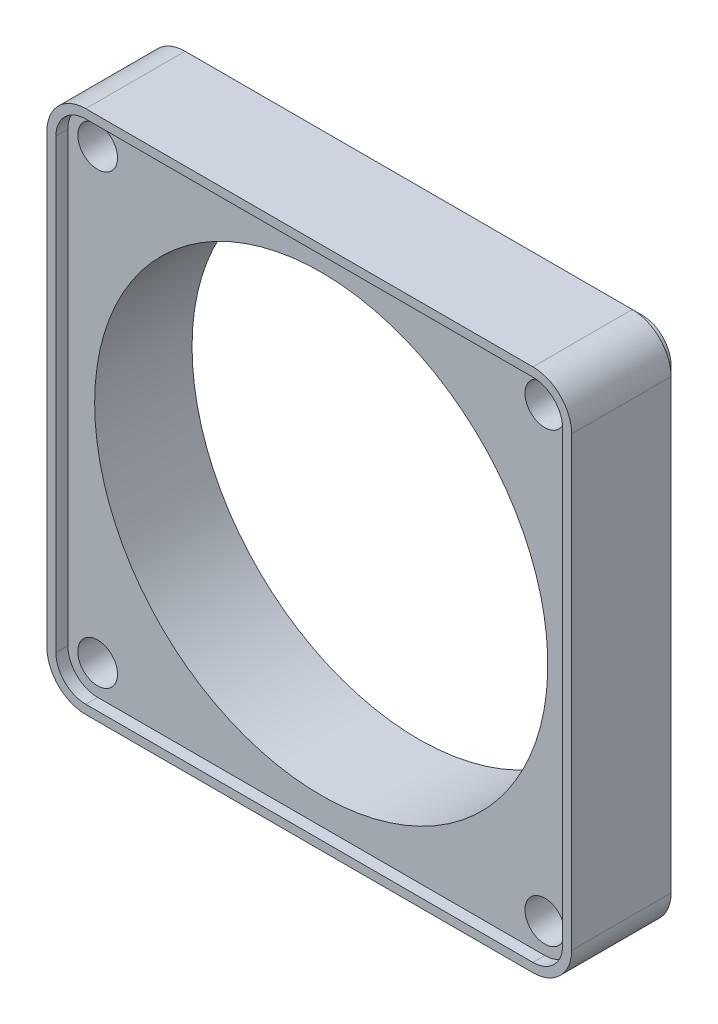
ISO-10303-21;
HEADER;
FILE_DESCRIPTION(('STEP AP214'),'2;1');
FILE_NAME('part.step','',(''),(''),'','','');
FILE_SCHEMA(('AUTOMOTIVE_DESIGN { 1 0 10303 214 1 1 1 1 }'));
ENDSEC;
DATA;
#1=APPLICATION_CONTEXT('core data for automotive mechanical design processes');
#2=APPLICATION_PROTOCOL_DEFINITION('international standard','automotive_design',2000,#1);
#3=PRODUCT_CONTEXT('',#1,'mechanical');
#4=PRODUCT('Part','Part','',(#3));
#5=PRODUCT_RELATED_PRODUCT_CATEGORY('part','',(#4));
#6=PRODUCT_DEFINITION_FORMATION('','',#4);
#7=PRODUCT_DEFINITION_CONTEXT('part definition',#1,'design');
#8=PRODUCT_DEFINITION('design','',#6,#7);
#9=PRODUCT_DEFINITION_SHAPE('','',#8);
#10=(LENGTH_UNIT() NAMED_UNIT(*) SI_UNIT(.MILLI.,.METRE.));
#11=(NAMED_UNIT(*) PLANE_ANGLE_UNIT() SI_UNIT($,.RADIAN.));
#12=(NAMED_UNIT(*) SI_UNIT($,.STERADIAN.) SOLID_ANGLE_UNIT());
#13=UNCERTAINTY_MEASURE_WITH_UNIT(LENGTH_MEASURE(1.E-05),#10,'distance_accuracy_value','');
#14=(GEOMETRIC_REPRESENTATION_CONTEXT(3) GLOBAL_UNCERTAINTY_ASSIGNED_CONTEXT((#13)) GLOBAL_UNIT_ASSIGNED_CONTEXT((#10,
#11,#12)) REPRESENTATION_CONTEXT('',''));
#15=CARTESIAN_POINT('',(0.,0.,0.));
#16=DIRECTION('',(0.,0.,1.));
#17=DIRECTION('',(1.,0.,0.));
#18=AXIS2_PLACEMENT_3D('',#15,#16,#17);
#19=CARTESIAN_POINT('',(13.2,-13.2,5.5));
#20=DIRECTION('',(-1.,0.,0.));
#21=DIRECTION('',(0.,0.,1.));
#22=AXIS2_PLACEMENT_3D('',#19,#20,#21);
#23=PLANE('',#22);
#24=DIRECTION('',(0.,1.,0.));
#25=VECTOR('',#24,1.);
#26=CARTESIAN_POINT('',(13.2,-11.25,0.5));
#27=LINE('',#26,#25);
#28=CARTESIAN_POINT('',(13.2,-11.25,0.5));
#29=VERTEX_POINT('',#28);
#30=CARTESIAN_POINT('',(13.2,11.25,0.5));
#31=VERTEX_POINT('',#30);
#32=EDGE_CURVE('E333',#29,#31,#27,.T.);
#33=ORIENTED_EDGE('',*,*,#32,.T.);
#34=DIRECTION('',(0.,0.,-1.));
#35=VECTOR('',#34,1.);
#36=CARTESIAN_POINT('',(13.2,11.25,5.5));
#37=LINE('',#36,#35);
#38=CARTESIAN_POINT('',(13.2,11.25,5.5));
#39=VERTEX_POINT('',#38);
#40=EDGE_CURVE('E230',#39,#31,#37,.T.);
#41=ORIENTED_EDGE('',*,*,#40,.F.);
#42=DIRECTION('',(0.,1.,0.));
#43=VECTOR('',#42,1.);
#44=CARTESIAN_POINT('',(13.2,-13.2,5.5));
#45=LINE('',#44,#43);
#46=CARTESIAN_POINT('',(13.2,-11.25,5.5));
#47=VERTEX_POINT('',#46);
#48=EDGE_CURVE('E203',#47,#39,#45,.T.);
#49=ORIENTED_EDGE('',*,*,#48,.F.);
#50=DIRECTION('',(0.,0.,-1.));
#51=VECTOR('',#50,1.);
#52=CARTESIAN_POINT('',(13.2,-11.25,5.5));
#53=LINE('',#52,#51);
#54=EDGE_CURVE('E195',#29,#47,#53,.F.);
#55=ORIENTED_EDGE('',*,*,#54,.F.);
#56=EDGE_LOOP('',(#33,#41,#49,#55));
#57=FACE_BOUND('',#56,.T.);
#58=ADVANCED_FACE('F17',(#57),#23,.F.);
#59=CARTESIAN_POINT('',(11.25,11.25,5.5));
#60=DIRECTION('',(0.,0.,-1.));
#61=DIRECTION('',(-1.,0.,0.));
#62=AXIS2_PLACEMENT_3D('',#59,#60,#61);
#63=CYLINDRICAL_SURFACE('',#62,1.95);
#64=CARTESIAN_POINT('',(11.25,11.25,5.5));
#65=DIRECTION('',(0.,0.,-1.));
#66=DIRECTION('',(-1.,0.,0.));
#67=AXIS2_PLACEMENT_3D('',#64,#65,#66);
#68=CIRCLE('',#67,1.95);
#69=CARTESIAN_POINT('',(11.25,13.2,5.5));
#70=VERTEX_POINT('',#69);
#71=EDGE_CURVE('E337',#39,#70,#68,.F.);
#72=ORIENTED_EDGE('',*,*,#71,.F.);
#73=ORIENTED_EDGE('',*,*,#40,.T.);
#74=CARTESIAN_POINT('',(11.25,11.25,0.5));
#75=DIRECTION('',(0.,0.,-1.));
#76=DIRECTION('',(-1.,0.,0.));
#77=AXIS2_PLACEMENT_3D('',#74,#75,#76);
#78=CIRCLE('',#77,1.95);
#79=CARTESIAN_POINT('',(11.25,13.2,0.5));
#80=VERTEX_POINT('',#79);
#81=EDGE_CURVE('E330',#31,#80,#78,.F.);
#82=ORIENTED_EDGE('',*,*,#81,.T.);
#83=DIRECTION('',(0.,0.,1.));
#84=VECTOR('',#83,1.);
#85=CARTESIAN_POINT('',(11.25,13.2,5.5));
#86=LINE('',#85,#84);
#87=EDGE_CURVE('E227',#80,#70,#86,.T.);
#88=ORIENTED_EDGE('',*,*,#87,.T.);
#89=EDGE_LOOP('',(#72,#73,#82,#88));
#90=FACE_BOUND('',#89,.T.);
#91=ADVANCED_FACE('F346',(#90),#63,.T.);
#92=CARTESIAN_POINT('',(13.2,13.2,5.5));
#93=DIRECTION('',(0.,-1.,0.));
#94=DIRECTION('',(1.,0.,0.));
#95=AXIS2_PLACEMENT_3D('',#92,#93,#94);
#96=PLANE('',#95);
#97=DIRECTION('',(1.,0.,0.));
#98=VECTOR('',#97,1.);
#99=CARTESIAN_POINT('',(11.25,13.2,0.5));
#100=LINE('',#99,#98);
#101=CARTESIAN_POINT('',(-11.25,13.2,0.5));
#102=VERTEX_POINT('',#101);
#103=EDGE_CURVE('E329',#80,#102,#100,.F.);
#104=ORIENTED_EDGE('',*,*,#103,.T.);
#105=DIRECTION('',(0.,0.,-1.));
#106=VECTOR('',#105,1.);
#107=CARTESIAN_POINT('',(-11.25,13.2,5.5));
#108=LINE('',#107,#106);
#109=CARTESIAN_POINT('',(-11.25,13.2,5.5));
#110=VERTEX_POINT('',#109);
#111=EDGE_CURVE('E225',#110,#102,#108,.T.);
#112=ORIENTED_EDGE('',*,*,#111,.F.);
#113=DIRECTION('',(1.,0.,0.));
#114=VECTOR('',#113,1.);
#115=CARTESIAN_POINT('',(-13.2,13.2,5.5));
#116=LINE('',#115,#114);
#117=EDGE_CURVE('E336',#70,#110,#116,.F.);
#118=ORIENTED_EDGE('',*,*,#117,.F.);
#119=ORIENTED_EDGE('',*,*,#87,.F.);
#120=EDGE_LOOP('',(#104,#112,#118,#119));
#121=FACE_BOUND('',#120,.T.);
#122=ADVANCED_FACE('F352',(#121),#96,.F.);
#123=CARTESIAN_POINT('',(-11.25,11.25,5.5));
#124=DIRECTION('',(0.,0.,-1.));
#125=DIRECTION('',(-1.,0.,0.));
#126=AXIS2_PLACEMENT_3D('',#123,#124,#125);
#127=CYLINDRICAL_SURFACE('',#126,1.95);
#128=CARTESIAN_POINT('',(-11.25,11.25,5.5));
#129=DIRECTION('',(0.,0.,-1.));
#130=DIRECTION('',(-1.,0.,0.));
#131=AXIS2_PLACEMENT_3D('',#128,#129,#130);
#132=CIRCLE('',#131,1.95);
#133=CARTESIAN_POINT('',(-13.2,11.25,5.5));
#134=VERTEX_POINT('',#133);
#135=EDGE_CURVE('E334',#110,#134,#132,.F.);
#136=ORIENTED_EDGE('',*,*,#135,.F.);
#137=ORIENTED_EDGE('',*,*,#111,.T.);
#138=CARTESIAN_POINT('',(-11.25,11.25,0.5));
#139=DIRECTION('',(0.,0.,-1.));
#140=DIRECTION('',(-1.,0.,0.));
#141=AXIS2_PLACEMENT_3D('',#138,#139,#140);
#142=CIRCLE('',#141,1.95);
#143=CARTESIAN_POINT('',(-13.2,11.25,0.5));
#144=VERTEX_POINT('',#143);
#145=EDGE_CURVE('E326',#102,#144,#142,.F.);
#146=ORIENTED_EDGE('',*,*,#145,.T.);
#147=DIRECTION('',(0.,0.,1.));
#148=VECTOR('',#147,1.);
#149=CARTESIAN_POINT('',(-13.2,11.25,5.5));
#150=LINE('',#149,#148);
#151=EDGE_CURVE('E223',#144,#134,#150,.T.);
#152=ORIENTED_EDGE('',*,*,#151,.T.);
#153=EDGE_LOOP('',(#136,#137,#146,#152));
#154=FACE_BOUND('',#153,.T.);
#155=ADVANCED_FACE('F675',(#154),#127,.T.);
#156=CARTESIAN_POINT('',(-13.2,13.2,5.5));
#157=DIRECTION('',(1.,0.,0.));
#158=DIRECTION('',(0.,1.,0.));
#159=AXIS2_PLACEMENT_3D('',#156,#157,#158);
#160=PLANE('',#159);
#161=DIRECTION('',(0.,1.,0.));
#162=VECTOR('',#161,1.);
#163=CARTESIAN_POINT('',(-13.2,-11.25,0.5));
#164=LINE('',#163,#162);
#165=CARTESIAN_POINT('',(-13.2,-11.25,0.5));
#166=VERTEX_POINT('',#165);
#167=EDGE_CURVE('E325',#144,#166,#164,.F.);
#168=ORIENTED_EDGE('',*,*,#167,.T.);
#169=DIRECTION('',(0.,0.,-1.));
#170=VECTOR('',#169,1.);
#171=CARTESIAN_POINT('',(-13.2,-11.25,5.5));
#172=LINE('',#171,#170);
#173=CARTESIAN_POINT('',(-13.2,-11.25,5.5));
#174=VERTEX_POINT('',#173);
#175=EDGE_CURVE('E196',#174,#166,#172,.T.);
#176=ORIENTED_EDGE('',*,*,#175,.F.);
#177=DIRECTION('',(0.,1.,0.));
#178=VECTOR('',#177,1.);
#179=CARTESIAN_POINT('',(-13.2,-13.2,5.5));
#180=LINE('',#179,#178);
#181=EDGE_CURVE('E177',#134,#174,#180,.F.);
#182=ORIENTED_EDGE('',*,*,#181,.F.);
#183=ORIENTED_EDGE('',*,*,#151,.F.);
#184=EDGE_LOOP('',(#168,#176,#182,#183));
#185=FACE_BOUND('',#184,.T.);
#186=ADVANCED_FACE('F357',(#185),#160,.F.);
#187=CARTESIAN_POINT('',(-11.25,-11.25,5.5));
#188=DIRECTION('',(0.,0.,-1.));
#189=DIRECTION('',(-1.,0.,0.));
#190=AXIS2_PLACEMENT_3D('',#187,#188,#189);
#191=CYLINDRICAL_SURFACE('',#190,1.95);
#192=CARTESIAN_POINT('',(-11.25,-11.25,5.5));
#193=DIRECTION('',(0.,0.,-1.));
#194=DIRECTION('',(-1.,0.,0.));
#195=AXIS2_PLACEMENT_3D('',#192,#193,#194);
#196=CIRCLE('',#195,1.95);
#197=CARTESIAN_POINT('',(-11.25,-13.2,5.5));
#198=VERTEX_POINT('',#197);
#199=EDGE_CURVE('E20',#174,#198,#196,.F.);
#200=ORIENTED_EDGE('',*,*,#199,.F.);
#201=ORIENTED_EDGE('',*,*,#175,.T.);
#202=CARTESIAN_POINT('',(-11.25,-11.25,0.5));
#203=DIRECTION('',(0.,0.,-1.));
#204=DIRECTION('',(-1.,0.,0.));
#205=AXIS2_PLACEMENT_3D('',#202,#203,#204);
#206=CIRCLE('',#205,1.95);
#207=CARTESIAN_POINT('',(-11.25,-13.2,0.5));
#208=VERTEX_POINT('',#207);
#209=EDGE_CURVE('E191',#166,#208,#206,.F.);
#210=ORIENTED_EDGE('',*,*,#209,.T.);
#211=DIRECTION('',(0.,0.,1.));
#212=VECTOR('',#211,1.);
#213=CARTESIAN_POINT('',(-11.25,-13.2,5.5));
#214=LINE('',#213,#212);
#215=EDGE_CURVE('E188',#208,#198,#214,.T.);
#216=ORIENTED_EDGE('',*,*,#215,.T.);
#217=EDGE_LOOP('',(#200,#201,#210,#216));
#218=FACE_BOUND('',#217,.T.);
#219=ADVANCED_FACE('F189',(#218),#191,.T.);
#220=CARTESIAN_POINT('',(-13.2,-13.2,5.5));
#221=DIRECTION('',(0.,1.,0.));
#222=DIRECTION('',(-1.,0.,0.));
#223=AXIS2_PLACEMENT_3D('',#220,#221,#222);
#224=PLANE('',#223);
#225=DIRECTION('',(1.,0.,0.));
#226=VECTOR('',#225,1.);
#227=CARTESIAN_POINT('',(11.25,-13.2,0.5));
#228=LINE('',#227,#226);
#229=CARTESIAN_POINT('',(11.25,-13.2,0.5));
#230=VERTEX_POINT('',#229);
#231=EDGE_CURVE('E323',#208,#230,#228,.T.);
#232=ORIENTED_EDGE('',*,*,#231,.T.);
#233=DIRECTION('',(0.,0.,-1.));
#234=VECTOR('',#233,1.);
#235=CARTESIAN_POINT('',(11.25,-13.2,5.5));
#236=LINE('',#235,#234);
#237=CARTESIAN_POINT('',(11.25,-13.2,5.5));
#238=VERTEX_POINT('',#237);
#239=EDGE_CURVE('E199',#238,#230,#236,.T.);
#240=ORIENTED_EDGE('',*,*,#239,.F.);
#241=DIRECTION('',(1.,0.,0.));
#242=VECTOR('',#241,1.);
#243=CARTESIAN_POINT('',(-13.2,-13.2,5.5));
#244=LINE('',#243,#242);
#245=EDGE_CURVE('E184',#198,#238,#244,.T.);
#246=ORIENTED_EDGE('',*,*,#245,.F.);
#247=ORIENTED_EDGE('',*,*,#215,.F.);
#248=EDGE_LOOP('',(#232,#240,#246,#247));
#249=FACE_BOUND('',#248,.T.);
#250=ADVANCED_FACE('F198',(#249),#224,.F.);
#251=CARTESIAN_POINT('',(11.25,-11.25,5.5));
#252=DIRECTION('',(0.,0.,-1.));
#253=DIRECTION('',(-1.,0.,0.));
#254=AXIS2_PLACEMENT_3D('',#251,#252,#253);
#255=CYLINDRICAL_SURFACE('',#254,1.95);
#256=CARTESIAN_POINT('',(11.25,-11.25,5.5));
#257=DIRECTION('',(0.,0.,-1.));
#258=DIRECTION('',(-1.,0.,0.));
#259=AXIS2_PLACEMENT_3D('',#256,#257,#258);
#260=CIRCLE('',#259,1.95);
#261=EDGE_CURVE('E201',#238,#47,#260,.F.);
#262=ORIENTED_EDGE('',*,*,#261,.F.);
#263=ORIENTED_EDGE('',*,*,#239,.T.);
#264=CARTESIAN_POINT('',(11.25,-11.25,0.5));
#265=DIRECTION('',(0.,0.,-1.));
#266=DIRECTION('',(-1.,0.,0.));
#267=AXIS2_PLACEMENT_3D('',#264,#265,#266);
#268=CIRCLE('',#267,1.95);
#269=EDGE_CURVE('E320',#230,#29,#268,.F.);
#270=ORIENTED_EDGE('',*,*,#269,.T.);
#271=ORIENTED_EDGE('',*,*,#54,.T.);
#272=EDGE_LOOP('',(#262,#263,#270,#271));
#273=FACE_BOUND('',#272,.T.);
#274=ADVANCED_FACE('F648',(#273),#255,.T.);
#275=CARTESIAN_POINT('',(-13.2,-13.2,5.5));
#276=DIRECTION('',(0.,0.,1.));
#277=DIRECTION('',(1.,0.,0.));
#278=AXIS2_PLACEMENT_3D('',#275,#276,#277);
#279=PLANE('',#278);
#280=CARTESIAN_POINT('',(11.25,-11.25,5.5));
#281=DIRECTION('',(0.,0.,1.));
#282=DIRECTION('',(1.,0.,0.));
#283=AXIS2_PLACEMENT_3D('',#280,#281,#282);
#284=CIRCLE('',#283,1.5);
#285=CARTESIAN_POINT('',(12.75,-11.25,5.5));
#286=VERTEX_POINT('',#285);
#287=CARTESIAN_POINT('',(11.25,-12.75,5.5));
#288=VERTEX_POINT('',#287);
#289=EDGE_CURVE('E211',#286,#288,#284,.F.);
#290=ORIENTED_EDGE('',*,*,#289,.T.);
#291=DIRECTION('',(1.,0.,0.));
#292=VECTOR('',#291,1.);
#293=CARTESIAN_POINT('',(11.25,-12.75,5.5));
#294=LINE('',#293,#292);
#295=CARTESIAN_POINT('',(-11.25,-12.75,5.5));
#296=VERTEX_POINT('',#295);
#297=EDGE_CURVE('E208',#296,#288,#294,.T.);
#298=ORIENTED_EDGE('',*,*,#297,.F.);
#299=CARTESIAN_POINT('',(-11.25,-11.25,5.5));
#300=DIRECTION('',(0.,0.,1.));
#301=DIRECTION('',(1.,0.,0.));
#302=AXIS2_PLACEMENT_3D('',#299,#300,#301);
#303=CIRCLE('',#302,1.5);
#304=CARTESIAN_POINT('',(-12.75,-11.25,5.5));
#305=VERTEX_POINT('',#304);
#306=EDGE_CURVE('E307',#296,#305,#303,.F.);
#307=ORIENTED_EDGE('',*,*,#306,.T.);
#308=DIRECTION('',(0.,1.,0.));
#309=VECTOR('',#308,1.);
#310=CARTESIAN_POINT('',(-12.75,-11.25,5.5));
#311=LINE('',#310,#309);
#312=CARTESIAN_POINT('',(-12.75,11.25,5.5));
#313=VERTEX_POINT('',#312);
#314=EDGE_CURVE('E310',#313,#305,#311,.F.);
#315=ORIENTED_EDGE('',*,*,#314,.F.);
#316=CARTESIAN_POINT('',(-11.25,11.25,5.5));
#317=DIRECTION('',(0.,0.,1.));
#318=DIRECTION('',(1.,0.,0.));
#319=AXIS2_PLACEMENT_3D('',#316,#317,#318);
#320=CIRCLE('',#319,1.5);
#321=CARTESIAN_POINT('',(-11.25,12.75,5.5));
#322=VERTEX_POINT('',#321);
#323=EDGE_CURVE('E219',#313,#322,#320,.F.);
#324=ORIENTED_EDGE('',*,*,#323,.T.);
#325=DIRECTION('',(1.,0.,0.));
#326=VECTOR('',#325,1.);
#327=CARTESIAN_POINT('',(-11.25,12.75,5.5));
#328=LINE('',#327,#326);
#329=CARTESIAN_POINT('',(11.25,12.75,5.5));
#330=VERTEX_POINT('',#329);
#331=EDGE_CURVE('E216',#330,#322,#328,.F.);
#332=ORIENTED_EDGE('',*,*,#331,.F.);
#333=CARTESIAN_POINT('',(11.25,11.25,5.5));
#334=DIRECTION('',(0.,0.,1.));
#335=DIRECTION('',(1.,0.,0.));
#336=AXIS2_PLACEMENT_3D('',#333,#334,#335);
#337=CIRCLE('',#336,1.5);
#338=CARTESIAN_POINT('',(12.75,11.25,5.5));
#339=VERTEX_POINT('',#338);
#340=EDGE_CURVE('E215',#330,#339,#337,.F.);
#341=ORIENTED_EDGE('',*,*,#340,.T.);
#342=DIRECTION('',(0.,1.,0.));
#343=VECTOR('',#342,1.);
#344=CARTESIAN_POINT('',(12.75,11.25,5.5));
#345=LINE('',#344,#343);
#346=EDGE_CURVE('E212',#286,#339,#345,.T.);
#347=ORIENTED_EDGE('',*,*,#346,.F.);
#348=EDGE_LOOP('',(#290,#298,#307,#315,#324,#332,#341,#347));
#349=FACE_BOUND('',#348,.T.);
#350=ORIENTED_EDGE('',*,*,#117,.T.);
#351=ORIENTED_EDGE('',*,*,#135,.T.);
#352=ORIENTED_EDGE('',*,*,#181,.T.);
#353=ORIENTED_EDGE('',*,*,#199,.T.);
#354=ORIENTED_EDGE('',*,*,#245,.T.);
#355=ORIENTED_EDGE('',*,*,#261,.T.);
#356=ORIENTED_EDGE('',*,*,#48,.T.);
#357=ORIENTED_EDGE('',*,*,#71,.T.);
#358=EDGE_LOOP('',(#350,#351,#352,#353,#354,#355,#356,#357));
#359=FACE_BOUND('',#358,.T.);
#360=ADVANCED_FACE('F181',(#349,#359),#279,.T.);
#361=CARTESIAN_POINT('',(11.25,-11.25,0.5));
#362=DIRECTION('',(0.,0.,1.));
#363=DIRECTION('',(1.,0.,0.));
#364=AXIS2_PLACEMENT_3D('',#361,#362,#363);
#365=PLANE('',#364);
#366=CARTESIAN_POINT('',(-11.25,-11.25,0.5));
#367=DIRECTION('',(0.,0.,-1.));
#368=DIRECTION('',(-1.,0.,0.));
#369=AXIS2_PLACEMENT_3D('',#366,#367,#368);
#370=CIRCLE('',#369,1.45);
#371=CARTESIAN_POINT('',(-11.25,-12.7,0.5));
#372=VERTEX_POINT('',#371);
#373=CARTESIAN_POINT('',(-12.7,-11.25,0.5));
#374=VERTEX_POINT('',#373);
#375=EDGE_CURVE('E303',#372,#374,#370,.T.);
#376=ORIENTED_EDGE('',*,*,#375,.F.);
#377=DIRECTION('',(1.,0.,0.));
#378=VECTOR('',#377,1.);
#379=CARTESIAN_POINT('',(-11.25,-12.7,0.5));
#380=LINE('',#379,#378);
#381=CARTESIAN_POINT('',(11.25,-12.7,0.5));
#382=VERTEX_POINT('',#381);
#383=EDGE_CURVE('E302',#372,#382,#380,.T.);
#384=ORIENTED_EDGE('',*,*,#383,.T.);
#385=CARTESIAN_POINT('',(11.25,-11.25,0.5));
#386=DIRECTION('',(0.,0.,-1.));
#387=DIRECTION('',(-1.,0.,0.));
#388=AXIS2_PLACEMENT_3D('',#385,#386,#387);
#389=CIRCLE('',#388,1.45);
#390=CARTESIAN_POINT('',(12.7,-11.25,0.5));
#391=VERTEX_POINT('',#390);
#392=EDGE_CURVE('E299',#391,#382,#389,.T.);
#393=ORIENTED_EDGE('',*,*,#392,.F.);
#394=DIRECTION('',(0.,1.,0.));
#395=VECTOR('',#394,1.);
#396=CARTESIAN_POINT('',(12.7,-11.25,0.5));
#397=LINE('',#396,#395);
#398=CARTESIAN_POINT('',(12.7,11.25,0.5));
#399=VERTEX_POINT('',#398);
#400=EDGE_CURVE('E298',#391,#399,#397,.T.);
#401=ORIENTED_EDGE('',*,*,#400,.T.);
#402=CARTESIAN_POINT('',(11.25,11.25,0.5));
#403=DIRECTION('',(0.,0.,-1.));
#404=DIRECTION('',(-1.,0.,0.));
#405=AXIS2_PLACEMENT_3D('',#402,#403,#404);
#406=CIRCLE('',#405,1.45);
#407=CARTESIAN_POINT('',(11.25,12.7,0.5));
#408=VERTEX_POINT('',#407);
#409=EDGE_CURVE('E295',#408,#399,#406,.T.);
#410=ORIENTED_EDGE('',*,*,#409,.F.);
#411=DIRECTION('',(1.,0.,0.));
#412=VECTOR('',#411,1.);
#413=CARTESIAN_POINT('',(11.25,12.7,0.5));
#414=LINE('',#413,#412);
#415=CARTESIAN_POINT('',(-11.25,12.7,0.5));
#416=VERTEX_POINT('',#415);
#417=EDGE_CURVE('E294',#408,#416,#414,.F.);
#418=ORIENTED_EDGE('',*,*,#417,.T.);
#419=CARTESIAN_POINT('',(-11.25,11.25,0.5));
#420=DIRECTION('',(0.,0.,-1.));
#421=DIRECTION('',(-1.,0.,0.));
#422=AXIS2_PLACEMENT_3D('',#419,#420,#421);
#423=CIRCLE('',#422,1.45);
#424=CARTESIAN_POINT('',(-12.7,11.25,0.5));
#425=VERTEX_POINT('',#424);
#426=EDGE_CURVE('E291',#425,#416,#423,.T.);
#427=ORIENTED_EDGE('',*,*,#426,.F.);
#428=DIRECTION('',(0.,1.,0.));
#429=VECTOR('',#428,1.);
#430=CARTESIAN_POINT('',(-12.7,11.25,0.5));
#431=LINE('',#430,#429);
#432=EDGE_CURVE('E366',#425,#374,#431,.F.);
#433=ORIENTED_EDGE('',*,*,#432,.T.);
#434=EDGE_LOOP('',(#376,#384,#393,#401,#410,#418,#427,#433));
#435=FACE_BOUND('',#434,.T.);
#436=ORIENTED_EDGE('',*,*,#231,.F.);
#437=ORIENTED_EDGE('',*,*,#209,.F.);
#438=ORIENTED_EDGE('',*,*,#167,.F.);
#439=ORIENTED_EDGE('',*,*,#145,.F.);
#440=ORIENTED_EDGE('',*,*,#103,.F.);
#441=ORIENTED_EDGE('',*,*,#81,.F.);
#442=ORIENTED_EDGE('',*,*,#32,.F.);
#443=ORIENTED_EDGE('',*,*,#269,.F.);
#444=EDGE_LOOP('',(#436,#437,#438,#439,#440,#441,#442,#443));
#445=FACE_BOUND('',#444,.T.);
#446=ADVANCED_FACE('F360',(#435,#445),#365,.F.);
#447=CARTESIAN_POINT('',(-11.25,11.25,4.9));
#448=DIRECTION('',(0.,0.,1.));
#449=DIRECTION('',(1.,0.,0.));
#450=AXIS2_PLACEMENT_3D('',#447,#448,#449);
#451=CYLINDRICAL_SURFACE('',#450,1.5);
#452=DIRECTION('',(0.,0.,1.));
#453=VECTOR('',#452,1.);
#454=CARTESIAN_POINT('',(-12.75,11.25,4.9));
#455=LINE('',#454,#453);
#456=CARTESIAN_POINT('',(-12.75,11.25,4.9));
#457=VERTEX_POINT('',#456);
#458=EDGE_CURVE('E306',#457,#313,#455,.T.);
#459=ORIENTED_EDGE('',*,*,#458,.F.);
#460=CARTESIAN_POINT('',(-11.25,11.25,4.9));
#461=DIRECTION('',(0.,0.,1.));
#462=DIRECTION('',(1.,0.,0.));
#463=AXIS2_PLACEMENT_3D('',#460,#461,#462);
#464=CIRCLE('',#463,1.5);
#465=CARTESIAN_POINT('',(-11.25,12.75,4.9));
#466=VERTEX_POINT('',#465);
#467=EDGE_CURVE('E278',#457,#466,#464,.F.);
#468=ORIENTED_EDGE('',*,*,#467,.T.);
#469=DIRECTION('',(0.,0.,1.));
#470=VECTOR('',#469,1.);
#471=CARTESIAN_POINT('',(-11.25,12.75,4.9));
#472=LINE('',#471,#470);
#473=EDGE_CURVE('E218',#322,#466,#472,.F.);
#474=ORIENTED_EDGE('',*,*,#473,.F.);
#475=ORIENTED_EDGE('',*,*,#323,.F.);
#476=EDGE_LOOP('',(#459,#468,#474,#475));
#477=FACE_BOUND('',#476,.T.);
#478=ADVANCED_FACE('F412',(#477),#451,.F.);
#479=CARTESIAN_POINT('',(-11.25,12.75,4.9));
#480=DIRECTION('',(0.,-1.,0.));
#481=DIRECTION('',(1.,0.,0.));
#482=AXIS2_PLACEMENT_3D('',#479,#480,#481);
#483=PLANE('',#482);
#484=DIRECTION('',(-1.,0.,0.));
#485=VECTOR('',#484,1.);
#486=CARTESIAN_POINT('',(-11.25,12.75,4.9));
#487=LINE('',#486,#485);
#488=CARTESIAN_POINT('',(11.25,12.75,4.9));
#489=VERTEX_POINT('',#488);
#490=EDGE_CURVE('E277',#466,#489,#487,.F.);
#491=ORIENTED_EDGE('',*,*,#490,.T.);
#492=DIRECTION('',(0.,0.,1.));
#493=VECTOR('',#492,1.);
#494=CARTESIAN_POINT('',(11.25,12.75,4.9));
#495=LINE('',#494,#493);
#496=EDGE_CURVE('E317',#489,#330,#495,.T.);
#497=ORIENTED_EDGE('',*,*,#496,.T.);
#498=ORIENTED_EDGE('',*,*,#331,.T.);
#499=ORIENTED_EDGE('',*,*,#473,.T.);
#500=EDGE_LOOP('',(#491,#497,#498,#499));
#501=FACE_BOUND('',#500,.T.);
#502=ADVANCED_FACE('F402',(#501),#483,.T.);
#503=CARTESIAN_POINT('',(11.25,11.25,4.9));
#504=DIRECTION('',(0.,0.,1.));
#505=DIRECTION('',(1.,0.,0.));
#506=AXIS2_PLACEMENT_3D('',#503,#504,#505);
#507=CYLINDRICAL_SURFACE('',#506,1.5);
#508=ORIENTED_EDGE('',*,*,#496,.F.);
#509=CARTESIAN_POINT('',(11.25,11.25,4.9));
#510=DIRECTION('',(0.,0.,1.));
#511=DIRECTION('',(1.,0.,0.));
#512=AXIS2_PLACEMENT_3D('',#509,#510,#511);
#513=CIRCLE('',#512,1.5);
#514=CARTESIAN_POINT('',(12.75,11.25,4.9));
#515=VERTEX_POINT('',#514);
#516=EDGE_CURVE('E274',#489,#515,#513,.F.);
#517=ORIENTED_EDGE('',*,*,#516,.T.);
#518=DIRECTION('',(0.,0.,1.));
#519=VECTOR('',#518,1.);
#520=CARTESIAN_POINT('',(12.75,11.25,4.9));
#521=LINE('',#520,#519);
#522=EDGE_CURVE('E214',#339,#515,#521,.F.);
#523=ORIENTED_EDGE('',*,*,#522,.F.);
#524=ORIENTED_EDGE('',*,*,#340,.F.);
#525=EDGE_LOOP('',(#508,#517,#523,#524));
#526=FACE_BOUND('',#525,.T.);
#527=ADVANCED_FACE('F615',(#526),#507,.F.);
#528=CARTESIAN_POINT('',(12.75,11.25,4.9));
#529=DIRECTION('',(-1.,0.,0.));
#530=DIRECTION('',(0.,0.,1.));
#531=AXIS2_PLACEMENT_3D('',#528,#529,#530);
#532=PLANE('',#531);
#533=DIRECTION('',(0.,1.,0.));
#534=VECTOR('',#533,1.);
#535=CARTESIAN_POINT('',(12.75,11.25,4.9));
#536=LINE('',#535,#534);
#537=CARTESIAN_POINT('',(12.75,-11.25,4.9));
#538=VERTEX_POINT('',#537);
#539=EDGE_CURVE('E273',#515,#538,#536,.F.);
#540=ORIENTED_EDGE('',*,*,#539,.T.);
#541=DIRECTION('',(0.,0.,1.));
#542=VECTOR('',#541,1.);
#543=CARTESIAN_POINT('',(12.75,-11.25,4.9));
#544=LINE('',#543,#542);
#545=EDGE_CURVE('E314',#538,#286,#544,.T.);
#546=ORIENTED_EDGE('',*,*,#545,.T.);
#547=ORIENTED_EDGE('',*,*,#346,.T.);
#548=ORIENTED_EDGE('',*,*,#522,.T.);
#549=EDGE_LOOP('',(#540,#546,#547,#548));
#550=FACE_BOUND('',#549,.T.);
#551=ADVANCED_FACE('F607',(#550),#532,.T.);
#552=CARTESIAN_POINT('',(11.25,-11.25,4.9));
#553=DIRECTION('',(0.,0.,1.));
#554=DIRECTION('',(1.,0.,0.));
#555=AXIS2_PLACEMENT_3D('',#552,#553,#554);
#556=CYLINDRICAL_SURFACE('',#555,1.5);
#557=ORIENTED_EDGE('',*,*,#545,.F.);
#558=CARTESIAN_POINT('',(11.25,-11.25,4.9));
#559=DIRECTION('',(0.,0.,1.));
#560=DIRECTION('',(1.,0.,0.));
#561=AXIS2_PLACEMENT_3D('',#558,#559,#560);
#562=CIRCLE('',#561,1.5);
#563=CARTESIAN_POINT('',(11.25,-12.75,4.9));
#564=VERTEX_POINT('',#563);
#565=EDGE_CURVE('E270',#538,#564,#562,.F.);
#566=ORIENTED_EDGE('',*,*,#565,.T.);
#567=DIRECTION('',(0.,0.,1.));
#568=VECTOR('',#567,1.);
#569=CARTESIAN_POINT('',(11.25,-12.75,4.9));
#570=LINE('',#569,#568);
#571=EDGE_CURVE('E210',#288,#564,#570,.F.);
#572=ORIENTED_EDGE('',*,*,#571,.F.);
#573=ORIENTED_EDGE('',*,*,#289,.F.);
#574=EDGE_LOOP('',(#557,#566,#572,#573));
#575=FACE_BOUND('',#574,.T.);
#576=ADVANCED_FACE('F599',(#575),#556,.F.);
#577=CARTESIAN_POINT('',(11.25,-12.75,4.9));
#578=DIRECTION('',(0.,1.,0.));
#579=DIRECTION('',(0.,0.,1.));
#580=AXIS2_PLACEMENT_3D('',#577,#578,#579);
#581=PLANE('',#580);
#582=DIRECTION('',(-1.,0.,0.));
#583=VECTOR('',#582,1.);
#584=CARTESIAN_POINT('',(-11.25,-12.75,4.9));
#585=LINE('',#584,#583);
#586=CARTESIAN_POINT('',(-11.25,-12.75,4.9));
#587=VERTEX_POINT('',#586);
#588=EDGE_CURVE('E269',#564,#587,#585,.T.);
#589=ORIENTED_EDGE('',*,*,#588,.T.);
#590=DIRECTION('',(0.,0.,1.));
#591=VECTOR('',#590,1.);
#592=CARTESIAN_POINT('',(-11.25,-12.75,4.9));
#593=LINE('',#592,#591);
#594=EDGE_CURVE('E311',#587,#296,#593,.T.);
#595=ORIENTED_EDGE('',*,*,#594,.T.);
#596=ORIENTED_EDGE('',*,*,#297,.T.);
#597=ORIENTED_EDGE('',*,*,#571,.T.);
#598=EDGE_LOOP('',(#589,#595,#596,#597));
#599=FACE_BOUND('',#598,.T.);
#600=ADVANCED_FACE('F591',(#599),#581,.T.);
#601=CARTESIAN_POINT('',(-11.25,-11.25,4.9));
#602=DIRECTION('',(0.,0.,1.));
#603=DIRECTION('',(1.,0.,0.));
#604=AXIS2_PLACEMENT_3D('',#601,#602,#603);
#605=CYLINDRICAL_SURFACE('',#604,1.5);
#606=ORIENTED_EDGE('',*,*,#594,.F.);
#607=CARTESIAN_POINT('',(-11.25,-11.25,4.9));
#608=DIRECTION('',(0.,0.,1.));
#609=DIRECTION('',(1.,0.,0.));
#610=AXIS2_PLACEMENT_3D('',#607,#608,#609);
#611=CIRCLE('',#610,1.5);
#612=CARTESIAN_POINT('',(-12.75,-11.25,4.9));
#613=VERTEX_POINT('',#612);
#614=EDGE_CURVE('E266',#587,#613,#611,.F.);
#615=ORIENTED_EDGE('',*,*,#614,.T.);
#616=DIRECTION('',(0.,0.,1.));
#617=VECTOR('',#616,1.);
#618=CARTESIAN_POINT('',(-12.75,-11.25,4.9));
#619=LINE('',#618,#617);
#620=EDGE_CURVE('E379',#305,#613,#619,.F.);
#621=ORIENTED_EDGE('',*,*,#620,.F.);
#622=ORIENTED_EDGE('',*,*,#306,.F.);
#623=EDGE_LOOP('',(#606,#615,#621,#622));
#624=FACE_BOUND('',#623,.T.);
#625=ADVANCED_FACE('F584',(#624),#605,.F.);
#626=CARTESIAN_POINT('',(-12.75,-11.25,4.9));
#627=DIRECTION('',(1.,0.,0.));
#628=DIRECTION('',(0.,1.,0.));
#629=AXIS2_PLACEMENT_3D('',#626,#627,#628);
#630=PLANE('',#629);
#631=DIRECTION('',(0.,1.,0.));
#632=VECTOR('',#631,1.);
#633=CARTESIAN_POINT('',(-12.75,11.25,4.9));
#634=LINE('',#633,#632);
#635=EDGE_CURVE('E265',#613,#457,#634,.T.);
#636=ORIENTED_EDGE('',*,*,#635,.T.);
#637=ORIENTED_EDGE('',*,*,#458,.T.);
#638=ORIENTED_EDGE('',*,*,#314,.T.);
#639=ORIENTED_EDGE('',*,*,#620,.T.);
#640=EDGE_LOOP('',(#636,#637,#638,#639));
#641=FACE_BOUND('',#640,.T.);
#642=ADVANCED_FACE('F413',(#641),#630,.T.);
#643=CARTESIAN_POINT('',(11.25,11.25,-48.95));
#644=DIRECTION('',(0.,0.,1.));
#645=DIRECTION('',(1.,0.,0.));
#646=AXIS2_PLACEMENT_3D('',#643,#644,#645);
#647=CYLINDRICAL_SURFACE('',#646,1.);
#648=CARTESIAN_POINT('',(11.25,11.25,0.));
#649=DIRECTION('',(0.,0.,1.));
#650=DIRECTION('',(1.,0.,0.));
#651=AXIS2_PLACEMENT_3D('',#648,#649,#650);
#652=CIRCLE('',#651,1.);
#653=CARTESIAN_POINT('',(12.25,11.25,0.));
#654=VERTEX_POINT('',#653);
#655=EDGE_CURVE('E259',#654,#654,#652,.F.);
#656=ORIENTED_EDGE('',*,*,#655,.T.);
#657=EDGE_LOOP('',(#656));
#658=FACE_BOUND('',#657,.T.);
#659=CARTESIAN_POINT('',(11.25,11.25,4.9));
#660=DIRECTION('',(0.,0.,1.));
#661=DIRECTION('',(1.,0.,0.));
#662=AXIS2_PLACEMENT_3D('',#659,#660,#661);
#663=CIRCLE('',#662,1.);
#664=CARTESIAN_POINT('',(12.25,11.25,4.9));
#665=VERTEX_POINT('',#664);
#666=EDGE_CURVE('E281',#665,#665,#663,.T.);
#667=ORIENTED_EDGE('',*,*,#666,.T.);
#668=EDGE_LOOP('',(#667));
#669=FACE_BOUND('',#668,.T.);
#670=ADVANCED_FACE('F569',(#658,#669),#647,.F.);
#671=CARTESIAN_POINT('',(-11.25,11.25,-48.95));
#672=DIRECTION('',(0.,0.,1.));
#673=DIRECTION('',(1.,0.,0.));
#674=AXIS2_PLACEMENT_3D('',#671,#672,#673);
#675=CYLINDRICAL_SURFACE('',#674,1.);
#676=CARTESIAN_POINT('',(-11.25,11.25,0.));
#677=DIRECTION('',(0.,0.,1.));
#678=DIRECTION('',(1.,0.,0.));
#679=AXIS2_PLACEMENT_3D('',#676,#677,#678);
#680=CIRCLE('',#679,1.);
#681=CARTESIAN_POINT('',(-10.25,11.25,0.));
#682=VERTEX_POINT('',#681);
#683=EDGE_CURVE('E256',#682,#682,#680,.F.);
#684=ORIENTED_EDGE('',*,*,#683,.T.);
#685=EDGE_LOOP('',(#684));
#686=FACE_BOUND('',#685,.T.);
#687=CARTESIAN_POINT('',(-11.25,11.25,4.9));
#688=DIRECTION('',(0.,0.,1.));
#689=DIRECTION('',(1.,0.,0.));
#690=AXIS2_PLACEMENT_3D('',#687,#688,#689);
#691=CIRCLE('',#690,1.);
#692=CARTESIAN_POINT('',(-10.25,11.25,4.9));
#693=VERTEX_POINT('',#692);
#694=EDGE_CURVE('E262',#693,#693,#691,.T.);
#695=ORIENTED_EDGE('',*,*,#694,.T.);
#696=EDGE_LOOP('',(#695));
#697=FACE_BOUND('',#696,.T.);
#698=ADVANCED_FACE('F561',(#686,#697),#675,.F.);
#699=CARTESIAN_POINT('',(-11.25,-11.25,-48.95));
#700=DIRECTION('',(0.,0.,1.));
#701=DIRECTION('',(1.,0.,0.));
#702=AXIS2_PLACEMENT_3D('',#699,#700,#701);
#703=CYLINDRICAL_SURFACE('',#702,1.);
#704=CARTESIAN_POINT('',(-11.25,-11.25,0.));
#705=DIRECTION('',(0.,0.,1.));
#706=DIRECTION('',(1.,0.,0.));
#707=AXIS2_PLACEMENT_3D('',#704,#705,#706);
#708=CIRCLE('',#707,1.);
#709=CARTESIAN_POINT('',(-10.25,-11.25,0.));
#710=VERTEX_POINT('',#709);
#711=EDGE_CURVE('E253',#710,#710,#708,.F.);
#712=ORIENTED_EDGE('',*,*,#711,.T.);
#713=EDGE_LOOP('',(#712));
#714=FACE_BOUND('',#713,.T.);
#715=CARTESIAN_POINT('',(-11.25,-11.25,4.9));
#716=DIRECTION('',(0.,0.,1.));
#717=DIRECTION('',(1.,0.,0.));
#718=AXIS2_PLACEMENT_3D('',#715,#716,#717);
#719=CIRCLE('',#718,1.);
#720=CARTESIAN_POINT('',(-10.25,-11.25,4.9));
#721=VERTEX_POINT('',#720);
#722=EDGE_CURVE('E287',#721,#721,#719,.T.);
#723=ORIENTED_EDGE('',*,*,#722,.T.);
#724=EDGE_LOOP('',(#723));
#725=FACE_BOUND('',#724,.T.);
#726=ADVANCED_FACE('F553',(#714,#725),#703,.F.);
#727=CARTESIAN_POINT('',(11.25,-11.25,-48.95));
#728=DIRECTION('',(0.,0.,1.));
#729=DIRECTION('',(1.,0.,0.));
#730=AXIS2_PLACEMENT_3D('',#727,#728,#729);
#731=CYLINDRICAL_SURFACE('',#730,1.);
#732=CARTESIAN_POINT('',(11.25,-11.25,0.));
#733=DIRECTION('',(0.,0.,1.));
#734=DIRECTION('',(1.,0.,0.));
#735=AXIS2_PLACEMENT_3D('',#732,#733,#734);
#736=CIRCLE('',#735,1.);
#737=CARTESIAN_POINT('',(12.25,-11.25,0.));
#738=VERTEX_POINT('',#737);
#739=EDGE_CURVE('E250',#738,#738,#736,.F.);
#740=ORIENTED_EDGE('',*,*,#739,.T.);
#741=EDGE_LOOP('',(#740));
#742=FACE_BOUND('',#741,.T.);
#743=CARTESIAN_POINT('',(11.25,-11.25,4.9));
#744=DIRECTION('',(0.,0.,1.));
#745=DIRECTION('',(1.,0.,0.));
#746=AXIS2_PLACEMENT_3D('',#743,#744,#745);
#747=CIRCLE('',#746,1.);
#748=CARTESIAN_POINT('',(12.25,-11.25,4.9));
#749=VERTEX_POINT('',#748);
#750=EDGE_CURVE('E284',#749,#749,#747,.T.);
#751=ORIENTED_EDGE('',*,*,#750,.T.);
#752=EDGE_LOOP('',(#751));
#753=FACE_BOUND('',#752,.T.);
#754=ADVANCED_FACE('F546',(#742,#753),#731,.F.);
#755=CARTESIAN_POINT('',(-11.25,-11.25,0.5));
#756=DIRECTION('',(0.,0.,-1.));
#757=DIRECTION('',(-1.,0.,0.));
#758=AXIS2_PLACEMENT_3D('',#755,#756,#757);
#759=CYLINDRICAL_SURFACE('',#758,1.45);
#760=ORIENTED_EDGE('',*,*,#375,.T.);
#761=DIRECTION('',(0.,0.,1.));
#762=VECTOR('',#761,1.);
#763=CARTESIAN_POINT('',(-12.7,-11.25,0.5));
#764=LINE('',#763,#762);
#765=CARTESIAN_POINT('',(-12.7,-11.25,0.));
#766=VERTEX_POINT('',#765);
#767=EDGE_CURVE('E290',#374,#766,#764,.F.);
#768=ORIENTED_EDGE('',*,*,#767,.T.);
#769=CARTESIAN_POINT('',(-11.25,-11.25,0.));
#770=DIRECTION('',(0.,0.,-1.));
#771=DIRECTION('',(-1.,0.,0.));
#772=AXIS2_PLACEMENT_3D('',#769,#770,#771);
#773=CIRCLE('',#772,1.45);
#774=CARTESIAN_POINT('',(-11.25,-12.7,0.));
#775=VERTEX_POINT('',#774);
#776=EDGE_CURVE('E247',#766,#775,#773,.F.);
#777=ORIENTED_EDGE('',*,*,#776,.T.);
#778=DIRECTION('',(0.,0.,1.));
#779=VECTOR('',#778,1.);
#780=CARTESIAN_POINT('',(-11.25,-12.7,0.5));
#781=LINE('',#780,#779);
#782=EDGE_CURVE('E305',#775,#372,#781,.T.);
#783=ORIENTED_EDGE('',*,*,#782,.T.);
#784=EDGE_LOOP('',(#760,#768,#777,#783));
#785=FACE_BOUND('',#784,.T.);
#786=ADVANCED_FACE('F448',(#785),#759,.T.);
#787=CARTESIAN_POINT('',(-11.25,-12.7,0.5));
#788=DIRECTION('',(0.,1.,0.));
#789=DIRECTION('',(0.,0.,1.));
#790=AXIS2_PLACEMENT_3D('',#787,#788,#789);
#791=PLANE('',#790);
#792=DIRECTION('',(0.,0.,-1.));
#793=VECTOR('',#792,1.);
#794=CARTESIAN_POINT('',(11.25,-12.7,0.5));
#795=LINE('',#794,#793);
#796=CARTESIAN_POINT('',(11.25,-12.7,0.));
#797=VERTEX_POINT('',#796);
#798=EDGE_CURVE('E301',#382,#797,#795,.T.);
#799=ORIENTED_EDGE('',*,*,#798,.F.);
#800=ORIENTED_EDGE('',*,*,#383,.F.);
#801=ORIENTED_EDGE('',*,*,#782,.F.);
#802=DIRECTION('',(1.,0.,0.));
#803=VECTOR('',#802,1.);
#804=CARTESIAN_POINT('',(-13.2,-12.7,0.));
#805=LINE('',#804,#803);
#806=EDGE_CURVE('E246',#775,#797,#805,.T.);
#807=ORIENTED_EDGE('',*,*,#806,.T.);
#808=EDGE_LOOP('',(#799,#800,#801,#807));
#809=FACE_BOUND('',#808,.T.);
#810=ADVANCED_FACE('F445',(#809),#791,.F.);
#811=CARTESIAN_POINT('',(11.25,-11.25,0.5));
#812=DIRECTION('',(0.,0.,-1.));
#813=DIRECTION('',(-1.,0.,0.));
#814=AXIS2_PLACEMENT_3D('',#811,#812,#813);
#815=CYLINDRICAL_SURFACE('',#814,1.45);
#816=ORIENTED_EDGE('',*,*,#392,.T.);
#817=ORIENTED_EDGE('',*,*,#798,.T.);
#818=CARTESIAN_POINT('',(11.25,-11.25,0.));
#819=DIRECTION('',(0.,0.,-1.));
#820=DIRECTION('',(-1.,0.,0.));
#821=AXIS2_PLACEMENT_3D('',#818,#819,#820);
#822=CIRCLE('',#821,1.45);
#823=CARTESIAN_POINT('',(12.7,-11.25,0.));
#824=VERTEX_POINT('',#823);
#825=EDGE_CURVE('E243',#797,#824,#822,.F.);
#826=ORIENTED_EDGE('',*,*,#825,.T.);
#827=DIRECTION('',(0.,0.,1.));
#828=VECTOR('',#827,1.);
#829=CARTESIAN_POINT('',(12.7,-11.25,0.5));
#830=LINE('',#829,#828);
#831=EDGE_CURVE('E376',#824,#391,#830,.T.);
#832=ORIENTED_EDGE('',*,*,#831,.T.);
#833=EDGE_LOOP('',(#816,#817,#826,#832));
#834=FACE_BOUND('',#833,.T.);
#835=ADVANCED_FACE('F433',(#834),#815,.T.);
#836=CARTESIAN_POINT('',(12.7,-11.25,0.5));
#837=DIRECTION('',(-1.,0.,0.));
#838=DIRECTION('',(0.,0.,1.));
#839=AXIS2_PLACEMENT_3D('',#836,#837,#838);
#840=PLANE('',#839);
#841=DIRECTION('',(0.,0.,-1.));
#842=VECTOR('',#841,1.);
#843=CARTESIAN_POINT('',(12.7,11.25,0.5));
#844=LINE('',#843,#842);
#845=CARTESIAN_POINT('',(12.7,11.25,0.));
#846=VERTEX_POINT('',#845);
#847=EDGE_CURVE('E297',#399,#846,#844,.T.);
#848=ORIENTED_EDGE('',*,*,#847,.F.);
#849=ORIENTED_EDGE('',*,*,#400,.F.);
#850=ORIENTED_EDGE('',*,*,#831,.F.);
#851=DIRECTION('',(0.,1.,0.));
#852=VECTOR('',#851,1.);
#853=CARTESIAN_POINT('',(12.7,-13.2,0.));
#854=LINE('',#853,#852);
#855=EDGE_CURVE('E242',#824,#846,#854,.T.);
#856=ORIENTED_EDGE('',*,*,#855,.T.);
#857=EDGE_LOOP('',(#848,#849,#850,#856));
#858=FACE_BOUND('',#857,.T.);
#859=ADVANCED_FACE('F462',(#858),#840,.F.);
#860=CARTESIAN_POINT('',(11.25,11.25,0.5));
#861=DIRECTION('',(0.,0.,-1.));
#862=DIRECTION('',(-1.,0.,0.));
#863=AXIS2_PLACEMENT_3D('',#860,#861,#862);
#864=CYLINDRICAL_SURFACE('',#863,1.45);
#865=ORIENTED_EDGE('',*,*,#409,.T.);
#866=ORIENTED_EDGE('',*,*,#847,.T.);
#867=CARTESIAN_POINT('',(11.25,11.25,0.));
#868=DIRECTION('',(0.,0.,-1.));
#869=DIRECTION('',(-1.,0.,0.));
#870=AXIS2_PLACEMENT_3D('',#867,#868,#869);
#871=CIRCLE('',#870,1.45);
#872=CARTESIAN_POINT('',(11.25,12.7,0.));
#873=VERTEX_POINT('',#872);
#874=EDGE_CURVE('E239',#846,#873,#871,.F.);
#875=ORIENTED_EDGE('',*,*,#874,.T.);
#876=DIRECTION('',(0.,0.,1.));
#877=VECTOR('',#876,1.);
#878=CARTESIAN_POINT('',(11.25,12.7,0.5));
#879=LINE('',#878,#877);
#880=EDGE_CURVE('E373',#873,#408,#879,.T.);
#881=ORIENTED_EDGE('',*,*,#880,.T.);
#882=EDGE_LOOP('',(#865,#866,#875,#881));
#883=FACE_BOUND('',#882,.T.);
#884=ADVANCED_FACE('F514',(#883),#864,.T.);
#885=CARTESIAN_POINT('',(11.25,12.7,0.5));
#886=DIRECTION('',(0.,-1.,0.));
#887=DIRECTION('',(1.,0.,0.));
#888=AXIS2_PLACEMENT_3D('',#885,#886,#887);
#889=PLANE('',#888);
#890=DIRECTION('',(0.,0.,-1.));
#891=VECTOR('',#890,1.);
#892=CARTESIAN_POINT('',(-11.25,12.7,0.5));
#893=LINE('',#892,#891);
#894=CARTESIAN_POINT('',(-11.25,12.7,0.));
#895=VERTEX_POINT('',#894);
#896=EDGE_CURVE('E293',#416,#895,#893,.T.);
#897=ORIENTED_EDGE('',*,*,#896,.F.);
#898=ORIENTED_EDGE('',*,*,#417,.F.);
#899=ORIENTED_EDGE('',*,*,#880,.F.);
#900=DIRECTION('',(1.,0.,0.));
#901=VECTOR('',#900,1.);
#902=CARTESIAN_POINT('',(-13.2,12.7,0.));
#903=LINE('',#902,#901);
#904=EDGE_CURVE('E238',#873,#895,#903,.F.);
#905=ORIENTED_EDGE('',*,*,#904,.T.);
#906=EDGE_LOOP('',(#897,#898,#899,#905));
#907=FACE_BOUND('',#906,.T.);
#908=ADVANCED_FACE('F458',(#907),#889,.F.);
#909=CARTESIAN_POINT('',(-11.25,11.25,0.5));
#910=DIRECTION('',(0.,0.,-1.));
#911=DIRECTION('',(-1.,0.,0.));
#912=AXIS2_PLACEMENT_3D('',#909,#910,#911);
#913=CYLINDRICAL_SURFACE('',#912,1.45);
#914=ORIENTED_EDGE('',*,*,#426,.T.);
#915=ORIENTED_EDGE('',*,*,#896,.T.);
#916=CARTESIAN_POINT('',(-11.25,11.25,0.));
#917=DIRECTION('',(0.,0.,-1.));
#918=DIRECTION('',(-1.,0.,0.));
#919=AXIS2_PLACEMENT_3D('',#916,#917,#918);
#920=CIRCLE('',#919,1.45);
#921=CARTESIAN_POINT('',(-12.7,11.25,0.));
#922=VERTEX_POINT('',#921);
#923=EDGE_CURVE('E235',#895,#922,#920,.F.);
#924=ORIENTED_EDGE('',*,*,#923,.T.);
#925=DIRECTION('',(0.,0.,1.));
#926=VECTOR('',#925,1.);
#927=CARTESIAN_POINT('',(-12.7,11.25,0.5));
#928=LINE('',#927,#926);
#929=EDGE_CURVE('E35',#922,#425,#928,.T.);
#930=ORIENTED_EDGE('',*,*,#929,.T.);
#931=EDGE_LOOP('',(#914,#915,#924,#930));
#932=FACE_BOUND('',#931,.T.);
#933=ADVANCED_FACE('F454',(#932),#913,.T.);
#934=CARTESIAN_POINT('',(-12.7,11.25,0.5));
#935=DIRECTION('',(1.,0.,0.));
#936=DIRECTION('',(0.,1.,0.));
#937=AXIS2_PLACEMENT_3D('',#934,#935,#936);
#938=PLANE('',#937);
#939=ORIENTED_EDGE('',*,*,#767,.F.);
#940=ORIENTED_EDGE('',*,*,#432,.F.);
#941=ORIENTED_EDGE('',*,*,#929,.F.);
#942=DIRECTION('',(0.,1.,0.));
#943=VECTOR('',#942,1.);
#944=CARTESIAN_POINT('',(-12.7,-13.2,0.));
#945=LINE('',#944,#943);
#946=EDGE_CURVE('E234',#922,#766,#945,.F.);
#947=ORIENTED_EDGE('',*,*,#946,.T.);
#948=EDGE_LOOP('',(#939,#940,#941,#947));
#949=FACE_BOUND('',#948,.T.);
#950=ADVANCED_FACE('F466',(#949),#938,.F.);
#951=CARTESIAN_POINT('',(-11.25,11.25,4.9));
#952=DIRECTION('',(0.,0.,-1.));
#953=DIRECTION('',(-1.,0.,0.));
#954=AXIS2_PLACEMENT_3D('',#951,#952,#953);
#955=PLANE('',#954);
#956=ORIENTED_EDGE('',*,*,#694,.F.);
#957=EDGE_LOOP('',(#956));
#958=FACE_BOUND('',#957,.T.);
#959=CARTESIAN_POINT('',(0.,0.,4.9));
#960=DIRECTION('',(0.,0.,-1.));
#961=DIRECTION('',(-1.,0.,0.));
#962=AXIS2_PLACEMENT_3D('',#959,#960,#961);
#963=CIRCLE('',#962,11.4);
#964=CARTESIAN_POINT('',(-11.4,0.,4.9));
#965=VERTEX_POINT('',#964);
#966=EDGE_CURVE('E26',#965,#965,#963,.T.);
#967=ORIENTED_EDGE('',*,*,#966,.T.);
#968=EDGE_LOOP('',(#967));
#969=FACE_BOUND('',#968,.T.);
#970=ORIENTED_EDGE('',*,*,#614,.F.);
#971=ORIENTED_EDGE('',*,*,#588,.F.);
#972=ORIENTED_EDGE('',*,*,#565,.F.);
#973=ORIENTED_EDGE('',*,*,#539,.F.);
#974=ORIENTED_EDGE('',*,*,#516,.F.);
#975=ORIENTED_EDGE('',*,*,#490,.F.);
#976=ORIENTED_EDGE('',*,*,#467,.F.);
#977=ORIENTED_EDGE('',*,*,#635,.F.);
#978=EDGE_LOOP('',(#970,#971,#972,#973,#974,#975,#976,#977));
#979=FACE_BOUND('',#978,.T.);
#980=ORIENTED_EDGE('',*,*,#666,.F.);
#981=EDGE_LOOP('',(#980));
#982=FACE_BOUND('',#981,.T.);
#983=ORIENTED_EDGE('',*,*,#750,.F.);
#984=EDGE_LOOP('',(#983));
#985=FACE_BOUND('',#984,.T.);
#986=ORIENTED_EDGE('',*,*,#722,.F.);
#987=EDGE_LOOP('',(#986));
#988=FACE_BOUND('',#987,.T.);
#989=ADVANCED_FACE('F407',(#958,#969,#979,#982,#985,#988),#955,.F.);
#990=CARTESIAN_POINT('',(-13.2,-13.2,0.));
#991=DIRECTION('',(0.,0.,1.));
#992=DIRECTION('',(1.,0.,0.));
#993=AXIS2_PLACEMENT_3D('',#990,#991,#992);
#994=PLANE('',#993);
#995=ORIENTED_EDGE('',*,*,#923,.F.);
#996=ORIENTED_EDGE('',*,*,#904,.F.);
#997=ORIENTED_EDGE('',*,*,#874,.F.);
#998=ORIENTED_EDGE('',*,*,#855,.F.);
#999=ORIENTED_EDGE('',*,*,#825,.F.);
#1000=ORIENTED_EDGE('',*,*,#806,.F.);
#1001=ORIENTED_EDGE('',*,*,#776,.F.);
#1002=ORIENTED_EDGE('',*,*,#946,.F.);
#1003=EDGE_LOOP('',(#995,#996,#997,#998,#999,#1000,#1001,#1002));
#1004=FACE_BOUND('',#1003,.T.);
#1005=ORIENTED_EDGE('',*,*,#739,.F.);
#1006=EDGE_LOOP('',(#1005));
#1007=FACE_BOUND('',#1006,.T.);
#1008=ORIENTED_EDGE('',*,*,#711,.F.);
#1009=EDGE_LOOP('',(#1008));
#1010=FACE_BOUND('',#1009,.T.);
#1011=ORIENTED_EDGE('',*,*,#683,.F.);
#1012=EDGE_LOOP('',(#1011));
#1013=FACE_BOUND('',#1012,.T.);
#1014=ORIENTED_EDGE('',*,*,#655,.F.);
#1015=EDGE_LOOP('',(#1014));
#1016=FACE_BOUND('',#1015,.T.);
#1017=CARTESIAN_POINT('',(0.,0.,0.));
#1018=DIRECTION('',(0.,0.,-1.));
#1019=DIRECTION('',(-1.,0.,0.));
#1020=AXIS2_PLACEMENT_3D('',#1017,#1018,#1019);
#1021=CIRCLE('',#1020,11.4);
#1022=CARTESIAN_POINT('',(-11.4,0.,0.));
#1023=VERTEX_POINT('',#1022);
#1024=EDGE_CURVE('E11',#1023,#1023,#1021,.F.);
#1025=ORIENTED_EDGE('',*,*,#1024,.T.);
#1026=EDGE_LOOP('',(#1025));
#1027=FACE_BOUND('',#1026,.T.);
#1028=ADVANCED_FACE('F441',(#1004,#1007,#1010,#1013,#1016,#1027),#994,.F.);
#1029=CARTESIAN_POINT('',(0.,0.,54.45));
#1030=DIRECTION('',(0.,0.,-1.));
#1031=DIRECTION('',(-1.,0.,0.));
#1032=AXIS2_PLACEMENT_3D('',#1029,#1030,#1031);
#1033=CYLINDRICAL_SURFACE('',#1032,11.4);
#1034=ORIENTED_EDGE('',*,*,#1024,.F.);
#1035=EDGE_LOOP('',(#1034));
#1036=FACE_BOUND('',#1035,.T.);
#1037=ORIENTED_EDGE('',*,*,#966,.F.);
#1038=EDGE_LOOP('',(#1037));
#1039=FACE_BOUND('',#1038,.T.);
#1040=ADVANCED_FACE('F477',(#1036,#1039),#1033,.F.);
#1041=CLOSED_SHELL('',(#58,#91,#122,#155,#186,#219,#250,#274,#360,#446,#478,#502,#527,#551,#576,
#600,#625,#642,#670,#698,#726,#754,#786,#810,#835,#859,#884,#908,#933,#950,#989,#1028,#1040));
#1042=MANIFOLD_SOLID_BREP('B1',#1041);
#1043=ADVANCED_BREP_SHAPE_REPRESENTATION('',(#18,#1042),#14);
#1044=SHAPE_DEFINITION_REPRESENTATION(#9,#1043);
ENDSEC;
END-ISO-10303-21;
